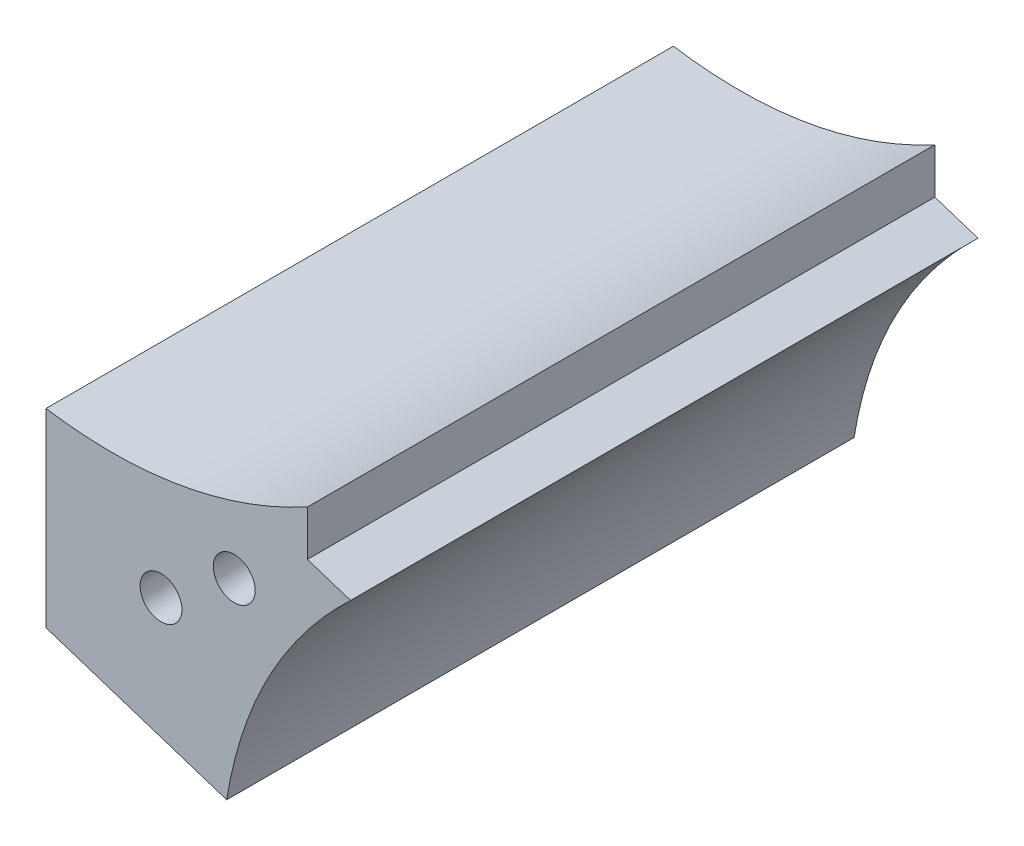
ISO-10303-21;
HEADER;
FILE_DESCRIPTION(('STEP AP214'),'2;1');
FILE_NAME('part.step','',(''),(''),'','','');
FILE_SCHEMA(('AUTOMOTIVE_DESIGN { 1 0 10303 214 1 1 1 1 }'));
ENDSEC;
DATA;
#1=APPLICATION_CONTEXT('core data for automotive mechanical design processes');
#2=APPLICATION_PROTOCOL_DEFINITION('international standard','automotive_design',2000,#1);
#3=PRODUCT_CONTEXT('',#1,'mechanical');
#4=PRODUCT('Part','Part','',(#3));
#5=PRODUCT_RELATED_PRODUCT_CATEGORY('part','',(#4));
#6=PRODUCT_DEFINITION_FORMATION('','',#4);
#7=PRODUCT_DEFINITION_CONTEXT('part definition',#1,'design');
#8=PRODUCT_DEFINITION('design','',#6,#7);
#9=PRODUCT_DEFINITION_SHAPE('','',#8);
#10=(LENGTH_UNIT() NAMED_UNIT(*) SI_UNIT(.MILLI.,.METRE.));
#11=(NAMED_UNIT(*) PLANE_ANGLE_UNIT() SI_UNIT($,.RADIAN.));
#12=(NAMED_UNIT(*) SI_UNIT($,.STERADIAN.) SOLID_ANGLE_UNIT());
#13=UNCERTAINTY_MEASURE_WITH_UNIT(LENGTH_MEASURE(1.E-05),#10,'distance_accuracy_value','');
#14=(GEOMETRIC_REPRESENTATION_CONTEXT(3) GLOBAL_UNCERTAINTY_ASSIGNED_CONTEXT((#13)) GLOBAL_UNIT_ASSIGNED_CONTEXT((#10,
#11,#12)) REPRESENTATION_CONTEXT('',''));
#15=CARTESIAN_POINT('',(0.,0.,0.));
#16=DIRECTION('',(0.,0.,1.));
#17=DIRECTION('',(1.,0.,0.));
#18=AXIS2_PLACEMENT_3D('',#15,#16,#17);
#19=CARTESIAN_POINT('',(-3.84429076225873,0.112777710413237,60.));
#20=DIRECTION('',(0.,0.,-1.));
#21=DIRECTION('',(-1.,0.,0.));
#22=AXIS2_PLACEMENT_3D('',#19,#20,#21);
#23=CYLINDRICAL_SURFACE('',#22,1.99999999999999);
#24=CARTESIAN_POINT('',(-3.84429076225873,0.112777710413237,60.));
#25=DIRECTION('',(0.,0.,1.));
#26=DIRECTION('',(1.,0.,0.));
#27=AXIS2_PLACEMENT_3D('',#24,#25,#26);
#28=CIRCLE('',#27,1.99999999999999);
#29=CARTESIAN_POINT('',(-1.84429076225873,0.112777710413237,60.));
#30=VERTEX_POINT('',#29);
#31=EDGE_CURVE('E169',#30,#30,#28,.T.);
#32=ORIENTED_EDGE('',*,*,#31,.T.);
#33=EDGE_LOOP('',(#32));
#34=FACE_BOUND('',#33,.T.);
#35=CARTESIAN_POINT('',(-3.84429076225873,0.112777710413237,55.));
#36=DIRECTION('',(0.,0.,-1.));
#37=DIRECTION('',(-1.,0.,0.));
#38=AXIS2_PLACEMENT_3D('',#35,#36,#37);
#39=CIRCLE('',#38,1.99999999999999);
#40=CARTESIAN_POINT('',(-5.84429076225872,0.112777710413237,55.));
#41=VERTEX_POINT('',#40);
#42=EDGE_CURVE('E175',#41,#41,#39,.T.);
#43=ORIENTED_EDGE('',*,*,#42,.T.);
#44=EDGE_LOOP('',(#43));
#45=FACE_BOUND('',#44,.T.);
#46=ADVANCED_FACE('F36',(#34,#45),#23,.F.);
#47=CARTESIAN_POINT('',(3.15570923774129,5.19857540645079,60.));
#48=DIRECTION('',(0.,0.,-1.));
#49=DIRECTION('',(-1.,0.,0.));
#50=AXIS2_PLACEMENT_3D('',#47,#48,#49);
#51=CYLINDRICAL_SURFACE('',#50,1.99999999999999);
#52=CARTESIAN_POINT('',(3.15570923774129,5.19857540645079,60.));
#53=DIRECTION('',(0.,0.,1.));
#54=DIRECTION('',(1.,0.,0.));
#55=AXIS2_PLACEMENT_3D('',#52,#53,#54);
#56=CIRCLE('',#55,1.99999999999999);
#57=CARTESIAN_POINT('',(5.15570923774129,5.19857540645079,60.));
#58=VERTEX_POINT('',#57);
#59=EDGE_CURVE('E172',#58,#58,#56,.T.);
#60=ORIENTED_EDGE('',*,*,#59,.T.);
#61=EDGE_LOOP('',(#60));
#62=FACE_BOUND('',#61,.T.);
#63=CARTESIAN_POINT('',(3.15570923774129,5.19857540645079,55.));
#64=DIRECTION('',(0.,0.,-1.));
#65=DIRECTION('',(-1.,0.,0.));
#66=AXIS2_PLACEMENT_3D('',#63,#64,#65);
#67=CIRCLE('',#66,1.99999999999999);
#68=CARTESIAN_POINT('',(1.1557092377413,5.19857540645079,55.));
#69=VERTEX_POINT('',#68);
#70=EDGE_CURVE('E40',#69,#69,#67,.T.);
#71=ORIENTED_EDGE('',*,*,#70,.T.);
#72=EDGE_LOOP('',(#71));
#73=FACE_BOUND('',#72,.T.);
#74=ADVANCED_FACE('F250',(#62,#73),#51,.F.);
#75=CARTESIAN_POINT('',(-2.16655929472154,10.3138890520142,60.));
#76=DIRECTION('',(0.,0.,1.));
#77=DIRECTION('',(1.,0.,0.));
#78=AXIS2_PLACEMENT_3D('',#75,#76,#77);
#79=PLANE('',#78);
#80=ORIENTED_EDGE('',*,*,#31,.F.);
#81=EDGE_LOOP('',(#80));
#82=FACE_BOUND('',#81,.T.);
#83=DIRECTION('',(-0.951056516317701,0.309016994305554,0.));
#84=VECTOR('',#83,1.);
#85=CARTESIAN_POINT('',(14.2799057139132,8.94434043657842,60.));
#86=LINE('',#85,#84);
#87=CARTESIAN_POINT('',(14.2799057141423,8.94434043680858,60.));
#88=VERTEX_POINT('',#87);
#89=CARTESIAN_POINT('',(10.1557092377413,10.2843731024883,60.));
#90=VERTEX_POINT('',#89);
#91=EDGE_CURVE('E167',#88,#90,#86,.T.);
#92=ORIENTED_EDGE('',*,*,#91,.T.);
#93=DIRECTION('',(0.,1.,0.));
#94=VECTOR('',#93,1.);
#95=CARTESIAN_POINT('',(10.1557092377413,10.2843731024883,60.));
#96=LINE('',#95,#94);
#97=CARTESIAN_POINT('',(10.1557092377413,14.6208099023545,60.));
#98=VERTEX_POINT('',#97);
#99=EDGE_CURVE('E96',#90,#98,#96,.T.);
#100=ORIENTED_EDGE('',*,*,#99,.T.);
#101=CARTESIAN_POINT('',(-157633.84811682,987546.404392985,60.));
#102=CARTESIAN_POINT('',(166185.101502372,-986083.896586904,60.));
#103=CARTESIAN_POINT('',(-174745.021125103,984662.644337032,60.));
#104=B_SPLINE_CURVE_WITH_KNOTS('',2,(#101,#102,#103),.UNSPECIFIED.,.F.,.F.,(3,3),(0.,1.),.UNSPECIFIED.);
#105=CARTESIAN_POINT('',(-14.844290762789,10.2843731025175,60.));
#106=VERTEX_POINT('',#105);
#107=EDGE_CURVE('E114',#98,#106,#104,.T.);
#108=ORIENTED_EDGE('',*,*,#107,.T.);
#109=DIRECTION('',(1.4636054628548E-11,-1.,0.));
#110=VECTOR('',#109,1.);
#111=CARTESIAN_POINT('',(-14.8442907625245,10.2843731025052,60.));
#112=LINE('',#111,#110);
#113=CARTESIAN_POINT('',(-14.8442907622586,-7.87919009764577,60.));
#114=VERTEX_POINT('',#113);
#115=EDGE_CURVE('E106',#106,#114,#112,.T.);
#116=ORIENTED_EDGE('',*,*,#115,.T.);
#117=DIRECTION('',(0.951056516295154,-0.309016994374947,0.));
#118=VECTOR('',#117,1.);
#119=CARTESIAN_POINT('',(-14.8442907622586,-7.87919009764577,60.));
#120=LINE('',#119,#118);
#121=CARTESIAN_POINT('',(2.43028437836731,-13.4920398048905,60.));
#122=VERTEX_POINT('',#121);
#123=EDGE_CURVE('E111',#114,#122,#120,.T.);
#124=ORIENTED_EDGE('',*,*,#123,.T.);
#125=CARTESIAN_POINT('',(882467.879441542,-470466.078091727,60.));
#126=CARTESIAN_POINT('',(-886470.258484106,462771.909385522,60.));
#127=CARTESIAN_POINT('',(890498.141487424,-455083.516365759,60.));
#128=B_SPLINE_CURVE_WITH_KNOTS('',2,(#125,#126,#127),.UNSPECIFIED.,.F.,.F.,(3,3),(0.,1.),.UNSPECIFIED.);
#129=EDGE_CURVE('E61',#122,#88,#128,.T.);
#130=ORIENTED_EDGE('',*,*,#129,.T.);
#131=EDGE_LOOP('',(#92,#100,#108,#116,#124,#130));
#132=FACE_BOUND('',#131,.T.);
#133=ORIENTED_EDGE('',*,*,#59,.F.);
#134=EDGE_LOOP('',(#133));
#135=FACE_BOUND('',#134,.T.);
#136=ADVANCED_FACE('F108',(#82,#132,#135),#79,.T.);
#137=CARTESIAN_POINT('',(-2.16655929472154,10.3138890520142,0.));
#138=DIRECTION('',(0.,0.,1.));
#139=DIRECTION('',(1.,0.,0.));
#140=AXIS2_PLACEMENT_3D('',#137,#138,#139);
#141=PLANE('',#140);
#142=DIRECTION('',(-0.809016994374947,-0.587785252292474,0.));
#143=VECTOR('',#142,1.);
#144=CARTESIAN_POINT('',(5.50685024691119,1.962507428951,0.));
#145=LINE('',#144,#143);
#146=CARTESIAN_POINT('',(5.50685024691119,1.962507428951,0.));
#147=VERTEX_POINT('',#146);
#148=CARTESIAN_POINT('',(-1.49314975308883,-3.12329026708655,0.));
#149=VERTEX_POINT('',#148);
#150=EDGE_CURVE('E196',#147,#149,#145,.T.);
#151=ORIENTED_EDGE('',*,*,#150,.F.);
#152=CARTESIAN_POINT('',(3.15570923774129,5.19857540645079,0.));
#153=DIRECTION('',(0.,0.,-1.));
#154=DIRECTION('',(-1.,0.,0.));
#155=AXIS2_PLACEMENT_3D('',#152,#153,#154);
#156=CIRCLE('',#155,4.);
#157=CARTESIAN_POINT('',(0.804568228571396,8.43464338395058,0.));
#158=VERTEX_POINT('',#157);
#159=EDGE_CURVE('E52',#158,#147,#156,.T.);
#160=ORIENTED_EDGE('',*,*,#159,.F.);
#161=DIRECTION('',(0.809016994374947,0.587785252292473,0.));
#162=VECTOR('',#161,1.);
#163=CARTESIAN_POINT('',(0.804568228571396,8.43464338395058,0.));
#164=LINE('',#163,#162);
#165=CARTESIAN_POINT('',(-6.19543177142863,3.34884568791303,0.));
#166=VERTEX_POINT('',#165);
#167=EDGE_CURVE('E189',#166,#158,#164,.T.);
#168=ORIENTED_EDGE('',*,*,#167,.F.);
#169=CARTESIAN_POINT('',(-3.84429076225873,0.112777710413237,0.));
#170=DIRECTION('',(0.,0.,-1.));
#171=DIRECTION('',(-1.,0.,0.));
#172=AXIS2_PLACEMENT_3D('',#169,#170,#171);
#173=CIRCLE('',#172,4.);
#174=EDGE_CURVE('E193',#149,#166,#173,.T.);
#175=ORIENTED_EDGE('',*,*,#174,.F.);
#176=EDGE_LOOP('',(#151,#160,#168,#175));
#177=FACE_BOUND('',#176,.T.);
#178=DIRECTION('',(-0.951056516317701,0.309016994305554,0.));
#179=VECTOR('',#178,1.);
#180=CARTESIAN_POINT('',(14.2799057139132,8.94434043657842,0.));
#181=LINE('',#180,#179);
#182=CARTESIAN_POINT('',(14.2799057141423,8.94434043680858,0.));
#183=VERTEX_POINT('',#182);
#184=CARTESIAN_POINT('',(10.1557092377413,10.2843731024883,0.));
#185=VERTEX_POINT('',#184);
#186=EDGE_CURVE('E138',#183,#185,#181,.T.);
#187=ORIENTED_EDGE('',*,*,#186,.F.);
#188=CARTESIAN_POINT('',(882467.879441542,-470466.078091727,0.));
#189=CARTESIAN_POINT('',(-886470.258484106,462771.909385522,0.));
#190=CARTESIAN_POINT('',(890498.141487424,-455083.516365759,0.));
#191=B_SPLINE_CURVE_WITH_KNOTS('',2,(#188,#189,#190),.UNSPECIFIED.,.F.,.F.,(3,3),(0.,1.),.UNSPECIFIED.);
#192=CARTESIAN_POINT('',(2.43028437836731,-13.4920398048905,0.));
#193=VERTEX_POINT('',#192);
#194=EDGE_CURVE('E88',#193,#183,#191,.T.);
#195=ORIENTED_EDGE('',*,*,#194,.F.);
#196=DIRECTION('',(0.951056516295154,-0.309016994374947,0.));
#197=VECTOR('',#196,1.);
#198=CARTESIAN_POINT('',(-14.8442907622586,-7.87919009764577,0.));
#199=LINE('',#198,#197);
#200=CARTESIAN_POINT('',(-14.8442907622586,-7.87919009764577,0.));
#201=VERTEX_POINT('',#200);
#202=EDGE_CURVE('E287',#201,#193,#199,.T.);
#203=ORIENTED_EDGE('',*,*,#202,.F.);
#204=DIRECTION('',(1.4636054628548E-11,-1.,0.));
#205=VECTOR('',#204,1.);
#206=CARTESIAN_POINT('',(-14.8442907625245,10.2843731025052,0.));
#207=LINE('',#206,#205);
#208=CARTESIAN_POINT('',(-14.844290762789,10.2843731025175,0.));
#209=VERTEX_POINT('',#208);
#210=EDGE_CURVE('E123',#209,#201,#207,.T.);
#211=ORIENTED_EDGE('',*,*,#210,.F.);
#212=CARTESIAN_POINT('',(-157633.84811682,987546.404392985,0.));
#213=CARTESIAN_POINT('',(166185.101502372,-986083.896586904,0.));
#214=CARTESIAN_POINT('',(-174745.021125103,984662.644337032,0.));
#215=B_SPLINE_CURVE_WITH_KNOTS('',2,(#212,#213,#214),.UNSPECIFIED.,.F.,.F.,(3,3),(0.,1.),.UNSPECIFIED.);
#216=CARTESIAN_POINT('',(10.1557092377413,14.6208099023545,0.));
#217=VERTEX_POINT('',#216);
#218=EDGE_CURVE('E277',#217,#209,#215,.T.);
#219=ORIENTED_EDGE('',*,*,#218,.F.);
#220=DIRECTION('',(0.,1.,0.));
#221=VECTOR('',#220,1.);
#222=CARTESIAN_POINT('',(10.1557092377413,10.2843731024883,0.));
#223=LINE('',#222,#221);
#224=EDGE_CURVE('E276',#185,#217,#223,.T.);
#225=ORIENTED_EDGE('',*,*,#224,.F.);
#226=EDGE_LOOP('',(#187,#195,#203,#211,#219,#225));
#227=FACE_BOUND('',#226,.T.);
#228=ADVANCED_FACE('F149',(#177,#227),#141,.F.);
#229=CARTESIAN_POINT('',(14.2799057139132,8.94434043657842,60.));
#230=DIRECTION('',(-0.309016994305554,-0.951056516317701,0.));
#231=DIRECTION('',(0.951056516317701,-0.309016994305554,0.));
#232=AXIS2_PLACEMENT_3D('',#229,#230,#231);
#233=PLANE('',#232);
#234=ORIENTED_EDGE('',*,*,#186,.T.);
#235=DIRECTION('',(0.,0.,-1.));
#236=VECTOR('',#235,1.);
#237=CARTESIAN_POINT('',(10.1557092377413,10.2843731024883,60.));
#238=LINE('',#237,#236);
#239=EDGE_CURVE('E11',#90,#185,#238,.T.);
#240=ORIENTED_EDGE('',*,*,#239,.F.);
#241=ORIENTED_EDGE('',*,*,#91,.F.);
#242=DIRECTION('',(0.,0.,-1.));
#243=VECTOR('',#242,1.);
#244=CARTESIAN_POINT('',(14.2799057141423,8.94434043680858,60.));
#245=LINE('',#244,#243);
#246=EDGE_CURVE('E131',#88,#183,#245,.T.);
#247=ORIENTED_EDGE('',*,*,#246,.T.);
#248=EDGE_LOOP('',(#234,#240,#241,#247));
#249=FACE_BOUND('',#248,.T.);
#250=ADVANCED_FACE('F38',(#249),#233,.F.);
#251=CARTESIAN_POINT('',(10.1557092377413,10.2843731024883,60.));
#252=DIRECTION('',(-1.,0.,0.));
#253=DIRECTION('',(0.,0.,1.));
#254=AXIS2_PLACEMENT_3D('',#251,#252,#253);
#255=PLANE('',#254);
#256=ORIENTED_EDGE('',*,*,#224,.T.);
#257=DIRECTION('',(0.,0.,-1.));
#258=VECTOR('',#257,1.);
#259=CARTESIAN_POINT('',(10.1557092377413,14.6208099023545,60.));
#260=LINE('',#259,#258);
#261=EDGE_CURVE('E45',#98,#217,#260,.T.);
#262=ORIENTED_EDGE('',*,*,#261,.F.);
#263=ORIENTED_EDGE('',*,*,#99,.F.);
#264=ORIENTED_EDGE('',*,*,#239,.T.);
#265=EDGE_LOOP('',(#256,#262,#263,#264));
#266=FACE_BOUND('',#265,.T.);
#267=ADVANCED_FACE('F157',(#266),#255,.F.);
#268=DIRECTION('',(0.,0.,-1.));
#269=VECTOR('',#268,1.);
#270=SURFACE_OF_LINEAR_EXTRUSION('',#104,#269);
#271=ORIENTED_EDGE('',*,*,#218,.T.);
#272=DIRECTION('',(0.,0.,-1.));
#273=VECTOR('',#272,1.);
#274=CARTESIAN_POINT('',(-14.844290762789,10.2843731025175,60.));
#275=LINE('',#274,#273);
#276=EDGE_CURVE('E126',#106,#209,#275,.T.);
#277=ORIENTED_EDGE('',*,*,#276,.F.);
#278=ORIENTED_EDGE('',*,*,#107,.F.);
#279=ORIENTED_EDGE('',*,*,#261,.T.);
#280=EDGE_LOOP('',(#271,#277,#278,#279));
#281=FACE_BOUND('',#280,.T.);
#282=ADVANCED_FACE('F155',(#281),#270,.F.);
#283=CARTESIAN_POINT('',(-14.8442907625245,10.2843731025052,60.));
#284=DIRECTION('',(1.,1.4636054628548E-11,0.));
#285=DIRECTION('',(-1.4636054628548E-11,1.,0.));
#286=AXIS2_PLACEMENT_3D('',#283,#284,#285);
#287=PLANE('',#286);
#288=ORIENTED_EDGE('',*,*,#210,.T.);
#289=DIRECTION('',(0.,0.,-1.));
#290=VECTOR('',#289,1.);
#291=CARTESIAN_POINT('',(-14.8442907622586,-7.87919009764577,60.));
#292=LINE('',#291,#290);
#293=EDGE_CURVE('E120',#114,#201,#292,.T.);
#294=ORIENTED_EDGE('',*,*,#293,.F.);
#295=ORIENTED_EDGE('',*,*,#115,.F.);
#296=ORIENTED_EDGE('',*,*,#276,.T.);
#297=EDGE_LOOP('',(#288,#294,#295,#296));
#298=FACE_BOUND('',#297,.T.);
#299=ADVANCED_FACE('F121',(#298),#287,.F.);
#300=CARTESIAN_POINT('',(-14.8442907622586,-7.87919009764577,60.));
#301=DIRECTION('',(0.309016994374947,0.951056516295154,0.));
#302=DIRECTION('',(-0.951056516295154,0.309016994374947,0.));
#303=AXIS2_PLACEMENT_3D('',#300,#301,#302);
#304=PLANE('',#303);
#305=ORIENTED_EDGE('',*,*,#202,.T.);
#306=DIRECTION('',(0.,0.,-1.));
#307=VECTOR('',#306,1.);
#308=CARTESIAN_POINT('',(2.43028437836731,-13.4920398048905,60.));
#309=LINE('',#308,#307);
#310=EDGE_CURVE('E127',#122,#193,#309,.T.);
#311=ORIENTED_EDGE('',*,*,#310,.F.);
#312=ORIENTED_EDGE('',*,*,#123,.F.);
#313=ORIENTED_EDGE('',*,*,#293,.T.);
#314=EDGE_LOOP('',(#305,#311,#312,#313));
#315=FACE_BOUND('',#314,.T.);
#316=ADVANCED_FACE('F129',(#315),#304,.F.);
#317=DIRECTION('',(0.,0.,-1.));
#318=VECTOR('',#317,1.);
#319=SURFACE_OF_LINEAR_EXTRUSION('',#128,#318);
#320=ORIENTED_EDGE('',*,*,#194,.T.);
#321=ORIENTED_EDGE('',*,*,#246,.F.);
#322=ORIENTED_EDGE('',*,*,#129,.F.);
#323=ORIENTED_EDGE('',*,*,#310,.T.);
#324=EDGE_LOOP('',(#320,#321,#322,#323));
#325=FACE_BOUND('',#324,.T.);
#326=ADVANCED_FACE('F144',(#325),#319,.F.);
#327=CARTESIAN_POINT('',(3.15570923774129,5.19857540645079,55.));
#328=DIRECTION('',(0.,0.,-1.));
#329=DIRECTION('',(-1.,0.,0.));
#330=AXIS2_PLACEMENT_3D('',#327,#328,#329);
#331=CYLINDRICAL_SURFACE('',#330,4.);
#332=ORIENTED_EDGE('',*,*,#159,.T.);
#333=DIRECTION('',(0.,0.,-1.));
#334=VECTOR('',#333,1.);
#335=CARTESIAN_POINT('',(5.50685024691119,1.962507428951,55.));
#336=LINE('',#335,#334);
#337=CARTESIAN_POINT('',(5.50685024691119,1.962507428951,55.));
#338=VERTEX_POINT('',#337);
#339=EDGE_CURVE('E178',#338,#147,#336,.T.);
#340=ORIENTED_EDGE('',*,*,#339,.F.);
#341=CARTESIAN_POINT('',(3.15570923774129,5.19857540645079,55.));
#342=DIRECTION('',(0.,0.,-1.));
#343=DIRECTION('',(-1.,0.,0.));
#344=AXIS2_PLACEMENT_3D('',#341,#342,#343);
#345=CIRCLE('',#344,4.);
#346=CARTESIAN_POINT('',(0.804568228571396,8.43464338395058,55.));
#347=VERTEX_POINT('',#346);
#348=EDGE_CURVE('E192',#347,#338,#345,.T.);
#349=ORIENTED_EDGE('',*,*,#348,.F.);
#350=DIRECTION('',(0.,0.,-1.));
#351=VECTOR('',#350,1.);
#352=CARTESIAN_POINT('',(0.804568228571396,8.43464338395058,55.));
#353=LINE('',#352,#351);
#354=EDGE_CURVE('E187',#347,#158,#353,.T.);
#355=ORIENTED_EDGE('',*,*,#354,.T.);
#356=EDGE_LOOP('',(#332,#340,#349,#355));
#357=FACE_BOUND('',#356,.T.);
#358=ADVANCED_FACE('F148',(#357),#331,.F.);
#359=CARTESIAN_POINT('',(0.804568228571396,8.43464338395058,55.));
#360=DIRECTION('',(-0.587785252292473,0.809016994374947,0.));
#361=DIRECTION('',(-0.809016994374947,-0.587785252292473,0.));
#362=AXIS2_PLACEMENT_3D('',#359,#360,#361);
#363=PLANE('',#362);
#364=ORIENTED_EDGE('',*,*,#167,.T.);
#365=ORIENTED_EDGE('',*,*,#354,.F.);
#366=DIRECTION('',(0.809016994374947,0.587785252292473,0.));
#367=VECTOR('',#366,1.);
#368=CARTESIAN_POINT('',(0.804568228571396,8.43464338395058,55.));
#369=LINE('',#368,#367);
#370=CARTESIAN_POINT('',(-6.19543177142863,3.34884568791303,55.));
#371=VERTEX_POINT('',#370);
#372=EDGE_CURVE('E181',#371,#347,#369,.T.);
#373=ORIENTED_EDGE('',*,*,#372,.F.);
#374=DIRECTION('',(0.,0.,-1.));
#375=VECTOR('',#374,1.);
#376=CARTESIAN_POINT('',(-6.19543177142863,3.34884568791303,55.));
#377=LINE('',#376,#375);
#378=EDGE_CURVE('E184',#371,#166,#377,.T.);
#379=ORIENTED_EDGE('',*,*,#378,.T.);
#380=EDGE_LOOP('',(#364,#365,#373,#379));
#381=FACE_BOUND('',#380,.T.);
#382=ADVANCED_FACE('F227',(#381),#363,.F.);
#383=CARTESIAN_POINT('',(-3.84429076225873,0.112777710413237,55.));
#384=DIRECTION('',(0.,0.,-1.));
#385=DIRECTION('',(-1.,0.,0.));
#386=AXIS2_PLACEMENT_3D('',#383,#384,#385);
#387=CYLINDRICAL_SURFACE('',#386,4.);
#388=ORIENTED_EDGE('',*,*,#174,.T.);
#389=ORIENTED_EDGE('',*,*,#378,.F.);
#390=CARTESIAN_POINT('',(-3.84429076225873,0.112777710413237,55.));
#391=DIRECTION('',(0.,0.,-1.));
#392=DIRECTION('',(-1.,0.,0.));
#393=AXIS2_PLACEMENT_3D('',#390,#391,#392);
#394=CIRCLE('',#393,4.);
#395=CARTESIAN_POINT('',(-1.49314975308883,-3.12329026708655,55.));
#396=VERTEX_POINT('',#395);
#397=EDGE_CURVE('E202',#396,#371,#394,.T.);
#398=ORIENTED_EDGE('',*,*,#397,.F.);
#399=DIRECTION('',(0.,0.,-1.));
#400=VECTOR('',#399,1.);
#401=CARTESIAN_POINT('',(-1.49314975308883,-3.12329026708655,55.));
#402=LINE('',#401,#400);
#403=EDGE_CURVE('E180',#396,#149,#402,.T.);
#404=ORIENTED_EDGE('',*,*,#403,.T.);
#405=EDGE_LOOP('',(#388,#389,#398,#404));
#406=FACE_BOUND('',#405,.T.);
#407=ADVANCED_FACE('F232',(#406),#387,.F.);
#408=CARTESIAN_POINT('',(5.50685024691119,1.962507428951,55.));
#409=DIRECTION('',(0.587785252292474,-0.809016994374947,0.));
#410=DIRECTION('',(0.809016994374947,0.587785252292474,0.));
#411=AXIS2_PLACEMENT_3D('',#408,#409,#410);
#412=PLANE('',#411);
#413=ORIENTED_EDGE('',*,*,#150,.T.);
#414=ORIENTED_EDGE('',*,*,#403,.F.);
#415=DIRECTION('',(-0.809016994374947,-0.587785252292474,0.));
#416=VECTOR('',#415,1.);
#417=CARTESIAN_POINT('',(5.50685024691119,1.962507428951,55.));
#418=LINE('',#417,#416);
#419=EDGE_CURVE('E205',#338,#396,#418,.T.);
#420=ORIENTED_EDGE('',*,*,#419,.F.);
#421=ORIENTED_EDGE('',*,*,#339,.T.);
#422=EDGE_LOOP('',(#413,#414,#420,#421));
#423=FACE_BOUND('',#422,.T.);
#424=ADVANCED_FACE('F238',(#423),#412,.F.);
#425=CARTESIAN_POINT('',(3.15570923774129,5.19857540645079,55.));
#426=DIRECTION('',(0.,0.,-1.));
#427=DIRECTION('',(-1.,0.,0.));
#428=AXIS2_PLACEMENT_3D('',#425,#426,#427);
#429=PLANE('',#428);
#430=ORIENTED_EDGE('',*,*,#42,.F.);
#431=EDGE_LOOP('',(#430));
#432=FACE_BOUND('',#431,.T.);
#433=ORIENTED_EDGE('',*,*,#70,.F.);
#434=EDGE_LOOP('',(#433));
#435=FACE_BOUND('',#434,.T.);
#436=ORIENTED_EDGE('',*,*,#348,.T.);
#437=ORIENTED_EDGE('',*,*,#419,.T.);
#438=ORIENTED_EDGE('',*,*,#397,.T.);
#439=ORIENTED_EDGE('',*,*,#372,.T.);
#440=EDGE_LOOP('',(#436,#437,#438,#439));
#441=FACE_BOUND('',#440,.T.);
#442=ADVANCED_FACE('F212',(#432,#435,#441),#429,.T.);
#443=CLOSED_SHELL('',(#46,#74,#136,#228,#250,#267,#282,#299,#316,#326,#358,#382,#407,#424,#442));
#444=MANIFOLD_SOLID_BREP('B2',#443);
#445=ADVANCED_BREP_SHAPE_REPRESENTATION('',(#18,#444),#14);
#446=SHAPE_DEFINITION_REPRESENTATION(#9,#445);
ENDSEC;
END-ISO-10303-21;
